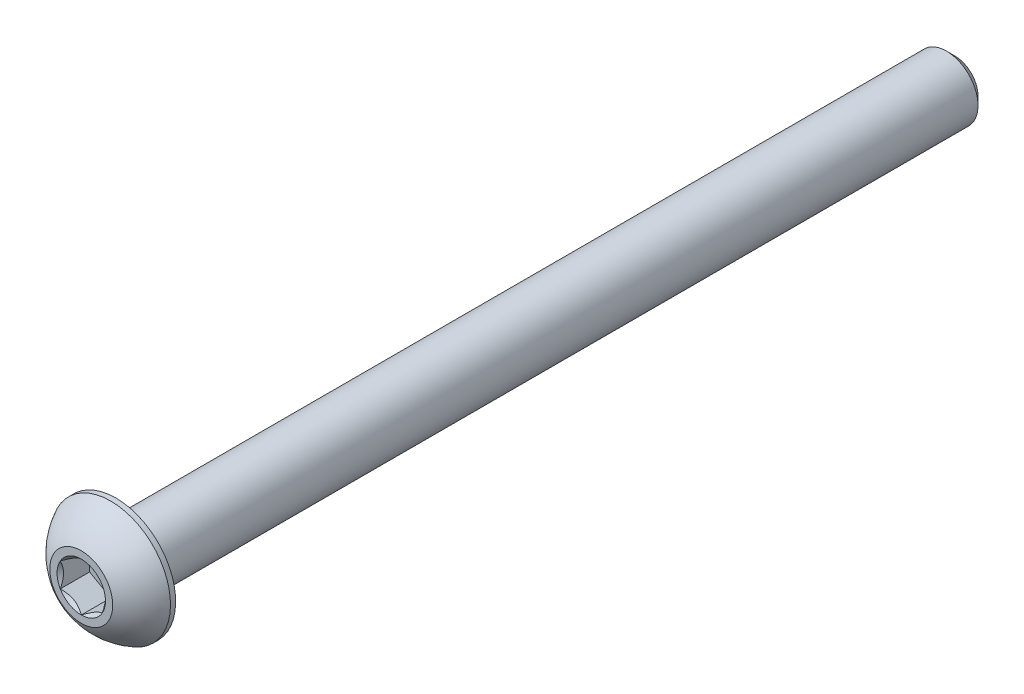
ISO-10303-21;
HEADER;
FILE_DESCRIPTION(('STEP AP214'),'2;1');
FILE_NAME('part.step','',(''),(''),'','','');
FILE_SCHEMA(('AUTOMOTIVE_DESIGN { 1 0 10303 214 1 1 1 1 }'));
ENDSEC;
DATA;
#1=APPLICATION_CONTEXT('core data for automotive mechanical design processes');
#2=APPLICATION_PROTOCOL_DEFINITION('international standard','automotive_design',2000,#1);
#3=PRODUCT_CONTEXT('',#1,'mechanical');
#4=PRODUCT('Part','Part','',(#3));
#5=PRODUCT_RELATED_PRODUCT_CATEGORY('part','',(#4));
#6=PRODUCT_DEFINITION_FORMATION('','',#4);
#7=PRODUCT_DEFINITION_CONTEXT('part definition',#1,'design');
#8=PRODUCT_DEFINITION('design','',#6,#7);
#9=PRODUCT_DEFINITION_SHAPE('','',#8);
#10=(LENGTH_UNIT() NAMED_UNIT(*) SI_UNIT(.MILLI.,.METRE.));
#11=(NAMED_UNIT(*) PLANE_ANGLE_UNIT() SI_UNIT($,.RADIAN.));
#12=(NAMED_UNIT(*) SI_UNIT($,.STERADIAN.) SOLID_ANGLE_UNIT());
#13=UNCERTAINTY_MEASURE_WITH_UNIT(LENGTH_MEASURE(1.E-05),#10,'distance_accuracy_value','');
#14=(GEOMETRIC_REPRESENTATION_CONTEXT(3) GLOBAL_UNCERTAINTY_ASSIGNED_CONTEXT((#13)) GLOBAL_UNIT_ASSIGNED_CONTEXT((#10,
#11,#12)) REPRESENTATION_CONTEXT('',''));
#15=CARTESIAN_POINT('',(0.,0.,0.));
#16=DIRECTION('',(0.,0.,1.));
#17=DIRECTION('',(1.,0.,0.));
#18=AXIS2_PLACEMENT_3D('',#15,#16,#17);
#19=CARTESIAN_POINT('',(1.,0.577350269189626,19.425));
#20=DIRECTION('',(0.5,0.866025403784439,0.));
#21=DIRECTION('',(0.,0.,-1.));
#22=AXIS2_PLACEMENT_3D('',#19,#20,#21);
#23=PLANE('',#22);
#24=DIRECTION('',(0.,0.,1.));
#25=VECTOR('',#24,1.);
#26=CARTESIAN_POINT('',(1.,0.577350269189626,19.425));
#27=LINE('',#26,#25);
#28=CARTESIAN_POINT('',(1.,0.577350269189626,19.425));
#29=VERTEX_POINT('',#28);
#30=CARTESIAN_POINT('',(1.,0.577350269189626,20.825));
#31=VERTEX_POINT('',#30);
#32=EDGE_CURVE('E11',#29,#31,#27,.T.);
#33=ORIENTED_EDGE('',*,*,#32,.T.);
#34=CARTESIAN_POINT('',(0.999999999999941,0.57735026918966,20.825));
#35=CARTESIAN_POINT('',(0.499999999999998,0.86602540378444,20.5363248654052));
#36=CARTESIAN_POINT('',(0.,1.15470053837922,20.825));
#37=(BOUNDED_CURVE() B_SPLINE_CURVE(2,(#34,#35,#36),.UNSPECIFIED.,.F.,
.F.) B_SPLINE_CURVE_WITH_KNOTS((3,3),(-0.321867155116298,-0.124274873543864),
.UNSPECIFIED.) CURVE() GEOMETRIC_REPRESENTATION_ITEM() RATIONAL_B_SPLINE_CURVE((1.46410161513779,
1.6905989232415,1.46410161513779)) REPRESENTATION_ITEM(''));
#38=CARTESIAN_POINT('',(0.,1.15470053837925,20.825));
#39=VERTEX_POINT('',#38);
#40=EDGE_CURVE('E123',#31,#39,#37,.T.);
#41=ORIENTED_EDGE('',*,*,#40,.T.);
#42=DIRECTION('',(0.,0.,1.));
#43=VECTOR('',#42,1.);
#44=CARTESIAN_POINT('',(0.,1.15470053837925,19.425));
#45=LINE('',#44,#43);
#46=CARTESIAN_POINT('',(0.,1.15470053837925,19.425));
#47=VERTEX_POINT('',#46);
#48=EDGE_CURVE('E257',#47,#39,#45,.T.);
#49=ORIENTED_EDGE('',*,*,#48,.F.);
#50=DIRECTION('',(-0.866025403784439,0.5,0.));
#51=VECTOR('',#50,1.);
#52=CARTESIAN_POINT('',(1.,0.577350269189626,19.425));
#53=LINE('',#52,#51);
#54=EDGE_CURVE('E237',#29,#47,#53,.T.);
#55=ORIENTED_EDGE('',*,*,#54,.F.);
#56=EDGE_LOOP('',(#33,#41,#49,#55));
#57=FACE_BOUND('',#56,.T.);
#58=ADVANCED_FACE('F17',(#57),#23,.F.);
#59=CARTESIAN_POINT('',(1.,-0.577350269189626,19.425));
#60=DIRECTION('',(1.,0.,0.));
#61=DIRECTION('',(0.,1.,0.));
#62=AXIS2_PLACEMENT_3D('',#59,#60,#61);
#63=PLANE('',#62);
#64=DIRECTION('',(0.,0.,1.));
#65=VECTOR('',#64,1.);
#66=CARTESIAN_POINT('',(1.,-0.577350269189626,19.425));
#67=LINE('',#66,#65);
#68=CARTESIAN_POINT('',(1.,-0.577350269189626,19.425));
#69=VERTEX_POINT('',#68);
#70=CARTESIAN_POINT('',(1.,-0.577350269189626,20.825));
#71=VERTEX_POINT('',#70);
#72=EDGE_CURVE('E25',#69,#71,#67,.T.);
#73=ORIENTED_EDGE('',*,*,#72,.T.);
#74=CARTESIAN_POINT('',(1.,-0.577350269189553,20.825));
#75=CARTESIAN_POINT('',(1.,0.,20.5363248654052));
#76=CARTESIAN_POINT('',(1.,0.577350269189567,20.825));
#77=(BOUNDED_CURVE() B_SPLINE_CURVE(2,(#74,#75,#76),.UNSPECIFIED.,.F.,
.F.) B_SPLINE_CURVE_WITH_KNOTS((3,3),(-0.321867155116297,-0.124274873543864),
.UNSPECIFIED.) CURVE() GEOMETRIC_REPRESENTATION_ITEM() RATIONAL_B_SPLINE_CURVE((1.46410161513779,
1.6905989232415,1.46410161513779)) REPRESENTATION_ITEM(''));
#78=EDGE_CURVE('E112',#71,#31,#77,.T.);
#79=ORIENTED_EDGE('',*,*,#78,.T.);
#80=ORIENTED_EDGE('',*,*,#32,.F.);
#81=DIRECTION('',(0.,1.,0.));
#82=VECTOR('',#81,1.);
#83=CARTESIAN_POINT('',(1.,-0.577350269189626,19.425));
#84=LINE('',#83,#82);
#85=EDGE_CURVE('E114',#69,#29,#84,.T.);
#86=ORIENTED_EDGE('',*,*,#85,.F.);
#87=EDGE_LOOP('',(#73,#79,#80,#86));
#88=FACE_BOUND('',#87,.T.);
#89=ADVANCED_FACE('F110',(#88),#63,.F.);
#90=CARTESIAN_POINT('',(0.,-1.15470053837925,19.425));
#91=DIRECTION('',(0.5,-0.866025403784439,0.));
#92=DIRECTION('',(0.,0.,-1.));
#93=AXIS2_PLACEMENT_3D('',#90,#91,#92);
#94=PLANE('',#93);
#95=DIRECTION('',(0.,0.,1.));
#96=VECTOR('',#95,1.);
#97=CARTESIAN_POINT('',(0.,-1.15470053837925,19.425));
#98=LINE('',#97,#96);
#99=CARTESIAN_POINT('',(0.,-1.15470053837925,19.425));
#100=VERTEX_POINT('',#99);
#101=CARTESIAN_POINT('',(0.,-1.15470053837925,20.825));
#102=VERTEX_POINT('',#101);
#103=EDGE_CURVE('E46',#100,#102,#98,.T.);
#104=ORIENTED_EDGE('',*,*,#103,.T.);
#105=CARTESIAN_POINT('',(0.,-1.15470053837922,20.825));
#106=CARTESIAN_POINT('',(0.500000000000004,-0.866025403784436,20.5363248654052));
#107=CARTESIAN_POINT('',(0.999999999999948,-0.577350269189655,20.825));
#108=(BOUNDED_CURVE() B_SPLINE_CURVE(2,(#105,#106,#107),.UNSPECIFIED.,.F.,
.F.) B_SPLINE_CURVE_WITH_KNOTS((3,3),(-0.321867155116297,-0.124274873543864),
.UNSPECIFIED.) CURVE() GEOMETRIC_REPRESENTATION_ITEM() RATIONAL_B_SPLINE_CURVE((1.46410161513779,
1.6905989232415,1.46410161513779)) REPRESENTATION_ITEM(''));
#109=EDGE_CURVE('E118',#102,#71,#108,.T.);
#110=ORIENTED_EDGE('',*,*,#109,.T.);
#111=ORIENTED_EDGE('',*,*,#72,.F.);
#112=DIRECTION('',(0.866025403784439,0.5,0.));
#113=VECTOR('',#112,1.);
#114=CARTESIAN_POINT('',(0.,-1.15470053837925,19.425));
#115=LINE('',#114,#113);
#116=EDGE_CURVE('E256',#100,#69,#115,.T.);
#117=ORIENTED_EDGE('',*,*,#116,.F.);
#118=EDGE_LOOP('',(#104,#110,#111,#117));
#119=FACE_BOUND('',#118,.T.);
#120=ADVANCED_FACE('F120',(#119),#94,.F.);
#121=CARTESIAN_POINT('',(-1.,-0.577350269189625,19.425));
#122=DIRECTION('',(-0.5,-0.866025403784439,0.));
#123=DIRECTION('',(-0.866025403784439,0.5,0.));
#124=AXIS2_PLACEMENT_3D('',#121,#122,#123);
#125=PLANE('',#124);
#126=DIRECTION('',(0.,0.,1.));
#127=VECTOR('',#126,1.);
#128=CARTESIAN_POINT('',(-1.,-0.577350269189625,19.425));
#129=LINE('',#128,#127);
#130=CARTESIAN_POINT('',(-1.,-0.577350269189625,19.425));
#131=VERTEX_POINT('',#130);
#132=CARTESIAN_POINT('',(-1.,-0.577350269189626,20.825));
#133=VERTEX_POINT('',#132);
#134=EDGE_CURVE('E267',#131,#133,#129,.T.);
#135=ORIENTED_EDGE('',*,*,#134,.T.);
#136=CARTESIAN_POINT('',(-0.999999999999945,-0.577350269189657,20.825));
#137=CARTESIAN_POINT('',(-0.499999999999999,-0.866025403784439,20.5363248654052));
#138=CARTESIAN_POINT('',(0.,-1.15470053837922,20.825));
#139=(BOUNDED_CURVE() B_SPLINE_CURVE(2,(#136,#137,#138),.UNSPECIFIED.,.F.,
.F.) B_SPLINE_CURVE_WITH_KNOTS((3,3),(-0.321867155116298,-0.124274873543864),
.UNSPECIFIED.) CURVE() GEOMETRIC_REPRESENTATION_ITEM() RATIONAL_B_SPLINE_CURVE((1.46410161513779,
1.6905989232415,1.46410161513779)) REPRESENTATION_ITEM(''));
#140=EDGE_CURVE('E124',#133,#102,#139,.T.);
#141=ORIENTED_EDGE('',*,*,#140,.T.);
#142=ORIENTED_EDGE('',*,*,#103,.F.);
#143=DIRECTION('',(0.866025403784439,-0.5,0.));
#144=VECTOR('',#143,1.);
#145=CARTESIAN_POINT('',(-1.,-0.577350269189625,19.425));
#146=LINE('',#145,#144);
#147=EDGE_CURVE('E252',#131,#100,#146,.T.);
#148=ORIENTED_EDGE('',*,*,#147,.F.);
#149=EDGE_LOOP('',(#135,#141,#142,#148));
#150=FACE_BOUND('',#149,.T.);
#151=ADVANCED_FACE('F387',(#150),#125,.F.);
#152=CARTESIAN_POINT('',(-1.,0.577350269189626,19.425));
#153=DIRECTION('',(-1.,0.,0.));
#154=DIRECTION('',(0.,0.,1.));
#155=AXIS2_PLACEMENT_3D('',#152,#153,#154);
#156=PLANE('',#155);
#157=DIRECTION('',(0.,0.,1.));
#158=VECTOR('',#157,1.);
#159=CARTESIAN_POINT('',(-1.,0.577350269189626,19.425));
#160=LINE('',#159,#158);
#161=CARTESIAN_POINT('',(-1.,0.577350269189626,19.425));
#162=VERTEX_POINT('',#161);
#163=CARTESIAN_POINT('',(-1.,0.577350269189627,20.825));
#164=VERTEX_POINT('',#163);
#165=EDGE_CURVE('E260',#162,#164,#160,.T.);
#166=ORIENTED_EDGE('',*,*,#165,.T.);
#167=CARTESIAN_POINT('',(-1.,0.57735026918957,20.825));
#168=CARTESIAN_POINT('',(-1.,0.,20.5363248654052));
#169=CARTESIAN_POINT('',(-1.,-0.577350269189566,20.825));
#170=(BOUNDED_CURVE() B_SPLINE_CURVE(2,(#167,#168,#169),.UNSPECIFIED.,.F.,
.F.) B_SPLINE_CURVE_WITH_KNOTS((3,3),(-0.3218671551163,-0.124274873543864),
.UNSPECIFIED.) CURVE() GEOMETRIC_REPRESENTATION_ITEM() RATIONAL_B_SPLINE_CURVE((1.46410161513778,
1.6905989232415,1.46410161513779)) REPRESENTATION_ITEM(''));
#171=EDGE_CURVE('E208',#164,#133,#170,.T.);
#172=ORIENTED_EDGE('',*,*,#171,.T.);
#173=ORIENTED_EDGE('',*,*,#134,.F.);
#174=DIRECTION('',(0.,-1.,0.));
#175=VECTOR('',#174,1.);
#176=CARTESIAN_POINT('',(-1.,0.577350269189626,19.425));
#177=LINE('',#176,#175);
#178=EDGE_CURVE('E248',#162,#131,#177,.T.);
#179=ORIENTED_EDGE('',*,*,#178,.F.);
#180=EDGE_LOOP('',(#166,#172,#173,#179));
#181=FACE_BOUND('',#180,.T.);
#182=ADVANCED_FACE('F393',(#181),#156,.F.);
#183=CARTESIAN_POINT('',(0.,1.15470053837925,19.425));
#184=DIRECTION('',(-0.5,0.866025403784439,0.));
#185=DIRECTION('',(0.,0.,1.));
#186=AXIS2_PLACEMENT_3D('',#183,#184,#185);
#187=PLANE('',#186);
#188=ORIENTED_EDGE('',*,*,#48,.T.);
#189=CARTESIAN_POINT('',(0.,1.15470053837922,20.825));
#190=CARTESIAN_POINT('',(-0.500000000000004,0.866025403784437,20.5363248654052));
#191=CARTESIAN_POINT('',(-0.999999999999948,0.577350269189656,20.825));
#192=(BOUNDED_CURVE() B_SPLINE_CURVE(2,(#189,#190,#191),.UNSPECIFIED.,.F.,
.F.) B_SPLINE_CURVE_WITH_KNOTS((3,3),(-0.321867155116297,-0.124274873543864),
.UNSPECIFIED.) CURVE() GEOMETRIC_REPRESENTATION_ITEM() RATIONAL_B_SPLINE_CURVE((1.46410161513779,
1.6905989232415,1.46410161513779)) REPRESENTATION_ITEM(''));
#193=EDGE_CURVE('E183',#39,#164,#192,.T.);
#194=ORIENTED_EDGE('',*,*,#193,.T.);
#195=ORIENTED_EDGE('',*,*,#165,.F.);
#196=DIRECTION('',(-0.866025403784439,-0.5,0.));
#197=VECTOR('',#196,1.);
#198=CARTESIAN_POINT('',(0.,1.15470053837925,19.425));
#199=LINE('',#198,#197);
#200=EDGE_CURVE('E244',#47,#162,#199,.T.);
#201=ORIENTED_EDGE('',*,*,#200,.F.);
#202=EDGE_LOOP('',(#188,#194,#195,#201));
#203=FACE_BOUND('',#202,.T.);
#204=ADVANCED_FACE('F380',(#203),#187,.F.);
#205=CARTESIAN_POINT('',(0.,0.,19.425));
#206=DIRECTION('',(0.,0.,1.));
#207=DIRECTION('',(1.,0.,0.));
#208=AXIS2_PLACEMENT_3D('',#205,#206,#207);
#209=PLANE('',#208);
#210=ORIENTED_EDGE('',*,*,#54,.T.);
#211=ORIENTED_EDGE('',*,*,#200,.T.);
#212=ORIENTED_EDGE('',*,*,#178,.T.);
#213=ORIENTED_EDGE('',*,*,#147,.T.);
#214=ORIENTED_EDGE('',*,*,#116,.T.);
#215=ORIENTED_EDGE('',*,*,#85,.T.);
#216=EDGE_LOOP('',(#210,#211,#212,#213,#214,#215));
#217=FACE_BOUND('',#216,.T.);
#218=ADVANCED_FACE('F386',(#217),#209,.T.);
#219=CARTESIAN_POINT('',(0.,0.,20.825));
#220=DIRECTION('',(0.,0.,1.));
#221=DIRECTION('',(1.,0.,0.));
#222=AXIS2_PLACEMENT_3D('',#219,#220,#221);
#223=CONICAL_SURFACE('',#222,1.15470053837925,0.78539816339745);
#224=CARTESIAN_POINT('',(0.,0.,20.825));
#225=DIRECTION('',(0.,0.,1.));
#226=DIRECTION('',(1.,0.,0.));
#227=AXIS2_PLACEMENT_3D('',#224,#225,#226);
#228=CIRCLE('',#227,1.15470053837925);
#229=EDGE_CURVE('E134',#31,#39,#228,.T.);
#230=ORIENTED_EDGE('',*,*,#229,.T.);
#231=ORIENTED_EDGE('',*,*,#40,.F.);
#232=EDGE_LOOP('',(#230,#231));
#233=FACE_BOUND('',#232,.T.);
#234=ADVANCED_FACE('F374',(#233),#223,.F.);
#235=CARTESIAN_POINT('',(0.,0.,20.825));
#236=DIRECTION('',(0.,0.,1.));
#237=DIRECTION('',(1.,0.,0.));
#238=AXIS2_PLACEMENT_3D('',#235,#236,#237);
#239=CONICAL_SURFACE('',#238,1.15470053837925,0.78539816339745);
#240=CARTESIAN_POINT('',(0.,0.,20.825));
#241=DIRECTION('',(0.,0.,1.));
#242=DIRECTION('',(1.,0.,0.));
#243=AXIS2_PLACEMENT_3D('',#240,#241,#242);
#244=CIRCLE('',#243,1.15470053837925);
#245=EDGE_CURVE('E127',#102,#71,#244,.T.);
#246=ORIENTED_EDGE('',*,*,#245,.T.);
#247=ORIENTED_EDGE('',*,*,#109,.F.);
#248=EDGE_LOOP('',(#246,#247));
#249=FACE_BOUND('',#248,.T.);
#250=ADVANCED_FACE('F129',(#249),#239,.F.);
#251=CARTESIAN_POINT('',(0.,0.,20.825));
#252=DIRECTION('',(0.,0.,1.));
#253=DIRECTION('',(1.,0.,0.));
#254=AXIS2_PLACEMENT_3D('',#251,#252,#253);
#255=CONICAL_SURFACE('',#254,1.15470053837925,0.78539816339745);
#256=CARTESIAN_POINT('',(0.,0.,20.825));
#257=DIRECTION('',(0.,0.,1.));
#258=DIRECTION('',(1.,0.,0.));
#259=AXIS2_PLACEMENT_3D('',#256,#257,#258);
#260=CIRCLE('',#259,1.15470053837925);
#261=EDGE_CURVE('E133',#133,#102,#260,.T.);
#262=ORIENTED_EDGE('',*,*,#261,.T.);
#263=ORIENTED_EDGE('',*,*,#140,.F.);
#264=EDGE_LOOP('',(#262,#263));
#265=FACE_BOUND('',#264,.T.);
#266=ADVANCED_FACE('F391',(#265),#255,.F.);
#267=CARTESIAN_POINT('',(0.,0.,20.825));
#268=DIRECTION('',(0.,0.,1.));
#269=DIRECTION('',(-1.,0.,0.));
#270=AXIS2_PLACEMENT_3D('',#267,#268,#269);
#271=CONICAL_SURFACE('',#270,1.15470053837925,0.78539816339745);
#272=CARTESIAN_POINT('',(0.,0.,20.825));
#273=DIRECTION('',(0.,0.,1.));
#274=DIRECTION('',(1.,0.,0.));
#275=AXIS2_PLACEMENT_3D('',#272,#273,#274);
#276=CIRCLE('',#275,1.15470053837925);
#277=EDGE_CURVE('E180',#164,#133,#276,.T.);
#278=ORIENTED_EDGE('',*,*,#277,.T.);
#279=ORIENTED_EDGE('',*,*,#171,.F.);
#280=EDGE_LOOP('',(#278,#279));
#281=FACE_BOUND('',#280,.T.);
#282=ADVANCED_FACE('F395',(#281),#271,.F.);
#283=CARTESIAN_POINT('',(0.,0.,20.825));
#284=DIRECTION('',(0.,0.,1.));
#285=DIRECTION('',(1.,0.,0.));
#286=AXIS2_PLACEMENT_3D('',#283,#284,#285);
#287=CONICAL_SURFACE('',#286,1.15470053837925,0.78539816339745);
#288=CARTESIAN_POINT('',(0.,0.,20.825));
#289=DIRECTION('',(0.,0.,1.));
#290=DIRECTION('',(1.,0.,0.));
#291=AXIS2_PLACEMENT_3D('',#288,#289,#290);
#292=CIRCLE('',#291,1.15470053837925);
#293=EDGE_CURVE('E163',#39,#164,#292,.T.);
#294=ORIENTED_EDGE('',*,*,#293,.T.);
#295=ORIENTED_EDGE('',*,*,#193,.F.);
#296=EDGE_LOOP('',(#294,#295));
#297=FACE_BOUND('',#296,.T.);
#298=ADVANCED_FACE('F378',(#297),#287,.F.);
#299=CARTESIAN_POINT('',(0.,0.,-20.825));
#300=DIRECTION('',(0.,0.,1.));
#301=DIRECTION('',(0.,-1.,0.));
#302=AXIS2_PLACEMENT_3D('',#299,#300,#301);
#303=PLANE('',#302);
#304=CARTESIAN_POINT('',(0.,0.,-20.825));
#305=DIRECTION('',(0.,0.,1.));
#306=DIRECTION('',(0.,-1.,0.));
#307=AXIS2_PLACEMENT_3D('',#304,#305,#306);
#308=CIRCLE('',#307,1.1);
#309=CARTESIAN_POINT('',(0.,1.1,-20.825));
#310=VERTEX_POINT('',#309);
#311=EDGE_CURVE('E165',#310,#310,#308,.T.);
#312=ORIENTED_EDGE('',*,*,#311,.F.);
#313=EDGE_LOOP('',(#312));
#314=FACE_BOUND('',#313,.T.);
#315=ADVANCED_FACE('F404',(#314),#303,.F.);
#316=CARTESIAN_POINT('',(0.,1.5,19.175));
#317=DIRECTION('',(0.,0.,1.));
#318=DIRECTION('',(0.,-1.,0.));
#319=AXIS2_PLACEMENT_3D('',#316,#317,#318);
#320=PLANE('',#319);
#321=CARTESIAN_POINT('',(0.,0.,19.175));
#322=DIRECTION('',(0.,0.,1.));
#323=DIRECTION('',(0.,-1.,0.));
#324=AXIS2_PLACEMENT_3D('',#321,#322,#323);
#325=CIRCLE('',#324,1.5);
#326=CARTESIAN_POINT('',(0.,1.5,19.175));
#327=VERTEX_POINT('',#326);
#328=EDGE_CURVE('E167',#327,#327,#325,.T.);
#329=ORIENTED_EDGE('',*,*,#328,.T.);
#330=EDGE_LOOP('',(#329));
#331=FACE_BOUND('',#330,.T.);
#332=CARTESIAN_POINT('',(0.,0.,19.175));
#333=DIRECTION('',(0.,0.,1.));
#334=DIRECTION('',(0.,-1.,0.));
#335=AXIS2_PLACEMENT_3D('',#332,#333,#334);
#336=CIRCLE('',#335,2.85);
#337=CARTESIAN_POINT('',(0.,2.85,19.175));
#338=VERTEX_POINT('',#337);
#339=EDGE_CURVE('E164',#338,#338,#336,.T.);
#340=ORIENTED_EDGE('',*,*,#339,.F.);
#341=EDGE_LOOP('',(#340));
#342=FACE_BOUND('',#341,.T.);
#343=ADVANCED_FACE('F436',(#331,#342),#320,.F.);
#344=CARTESIAN_POINT('',(0.,0.,20.825));
#345=DIRECTION('',(0.,0.,-1.));
#346=DIRECTION('',(0.,-1.,0.));
#347=AXIS2_PLACEMENT_3D('',#344,#345,#346);
#348=PLANE('',#347);
#349=ORIENTED_EDGE('',*,*,#293,.F.);
#350=ORIENTED_EDGE('',*,*,#229,.F.);
#351=CARTESIAN_POINT('',(0.,0.,20.825));
#352=DIRECTION('',(0.,0.,1.));
#353=DIRECTION('',(1.,0.,0.));
#354=AXIS2_PLACEMENT_3D('',#351,#352,#353);
#355=CIRCLE('',#354,1.15470053837925);
#356=EDGE_CURVE('E138',#71,#31,#355,.T.);
#357=ORIENTED_EDGE('',*,*,#356,.F.);
#358=ORIENTED_EDGE('',*,*,#245,.F.);
#359=ORIENTED_EDGE('',*,*,#261,.F.);
#360=ORIENTED_EDGE('',*,*,#277,.F.);
#361=EDGE_LOOP('',(#349,#350,#357,#358,#359,#360));
#362=FACE_BOUND('',#361,.T.);
#363=CARTESIAN_POINT('',(0.,0.,20.825));
#364=DIRECTION('',(0.,0.,1.));
#365=DIRECTION('',(0.,-1.,0.));
#366=AXIS2_PLACEMENT_3D('',#363,#364,#365);
#367=CIRCLE('',#366,1.5);
#368=CARTESIAN_POINT('',(0.,1.5,20.825));
#369=VERTEX_POINT('',#368);
#370=EDGE_CURVE('E157',#369,#369,#367,.T.);
#371=ORIENTED_EDGE('',*,*,#370,.T.);
#372=EDGE_LOOP('',(#371));
#373=FACE_BOUND('',#372,.T.);
#374=ADVANCED_FACE('F140',(#362,#373),#348,.F.);
#375=CARTESIAN_POINT('',(0.,0.,18.0301671122995));
#376=DIRECTION('',(-1.,0.,0.));
#377=DIRECTION('',(0.,1.,0.));
#378=AXIS2_PLACEMENT_3D('',#375,#376,#377);
#379=SPHERICAL_SURFACE('',#378,3.17192226735973);
#380=CARTESIAN_POINT('',(0.,0.,18.0301671122995));
#381=DIRECTION('',(0.,0.,1.));
#382=DIRECTION('',(0.,-1.,0.));
#383=AXIS2_PLACEMENT_3D('',#380,#381,#382);
#384=SPHERICAL_SURFACE('',#383,3.17192226735973);
#385=ORIENTED_EDGE('',*,*,#370,.F.);
#386=EDGE_LOOP('',(#385));
#387=FACE_BOUND('',#386,.T.);
#388=CARTESIAN_POINT('',(0.,0.,19.4225));
#389=DIRECTION('',(0.,0.,1.));
#390=DIRECTION('',(0.,-1.,0.));
#391=AXIS2_PLACEMENT_3D('',#388,#389,#390);
#392=CIRCLE('',#391,2.85);
#393=CARTESIAN_POINT('',(0.,2.85,19.4225));
#394=VERTEX_POINT('',#393);
#395=EDGE_CURVE('E192',#394,#394,#392,.T.);
#396=ORIENTED_EDGE('',*,*,#395,.T.);
#397=EDGE_LOOP('',(#396));
#398=FACE_BOUND('',#397,.T.);
#399=ADVANCED_FACE('F460',(#387,#398),#384,.T.);
#400=CARTESIAN_POINT('',(0.,0.,20.825));
#401=DIRECTION('',(0.,0.,1.));
#402=DIRECTION('',(0.,-1.,0.));
#403=AXIS2_PLACEMENT_3D('',#400,#401,#402);
#404=CYLINDRICAL_SURFACE('',#403,2.85);
#405=ORIENTED_EDGE('',*,*,#395,.F.);
#406=DIRECTION('',(0.,0.,-1.));
#407=VECTOR('',#406,1.);
#408=CARTESIAN_POINT('',(0.,2.85,20.825));
#409=LINE('',#408,#407);
#410=EDGE_CURVE('E188',#394,#338,#409,.T.);
#411=ORIENTED_EDGE('',*,*,#410,.T.);
#412=ORIENTED_EDGE('',*,*,#339,.T.);
#413=ORIENTED_EDGE('',*,*,#410,.F.);
#414=EDGE_LOOP('',(#405,#411,#412,#413));
#415=FACE_BOUND('',#414,.T.);
#416=ADVANCED_FACE('F458',(#415),#404,.T.);
#417=CARTESIAN_POINT('',(0.,0.,20.825));
#418=DIRECTION('',(0.,0.,1.));
#419=DIRECTION('',(0.,-1.,0.));
#420=AXIS2_PLACEMENT_3D('',#417,#418,#419);
#421=CYLINDRICAL_SURFACE('',#420,1.5);
#422=ORIENTED_EDGE('',*,*,#328,.F.);
#423=DIRECTION('',(0.,0.,-1.));
#424=VECTOR('',#423,1.);
#425=CARTESIAN_POINT('',(0.,1.5,20.825));
#426=LINE('',#425,#424);
#427=CARTESIAN_POINT('',(0.,1.5,-20.425));
#428=VERTEX_POINT('',#427);
#429=EDGE_CURVE('E179',#327,#428,#426,.T.);
#430=ORIENTED_EDGE('',*,*,#429,.T.);
#431=CARTESIAN_POINT('',(0.,0.,-20.425));
#432=DIRECTION('',(0.,0.,1.));
#433=DIRECTION('',(0.,-1.,0.));
#434=AXIS2_PLACEMENT_3D('',#431,#432,#433);
#435=CIRCLE('',#434,1.5);
#436=EDGE_CURVE('E145',#428,#428,#435,.T.);
#437=ORIENTED_EDGE('',*,*,#436,.T.);
#438=ORIENTED_EDGE('',*,*,#429,.F.);
#439=EDGE_LOOP('',(#422,#430,#437,#438));
#440=FACE_BOUND('',#439,.T.);
#441=ADVANCED_FACE('F453',(#440),#421,.T.);
#442=CARTESIAN_POINT('',(0.,0.,-20.825));
#443=DIRECTION('',(0.,0.,1.));
#444=DIRECTION('',(0.,-1.,0.));
#445=AXIS2_PLACEMENT_3D('',#442,#443,#444);
#446=CONICAL_SURFACE('',#445,1.1,0.785398163397448);
#447=ORIENTED_EDGE('',*,*,#436,.F.);
#448=DIRECTION('',(0.,-0.707106781186548,-0.707106781186548));
#449=VECTOR('',#448,1.);
#450=CARTESIAN_POINT('',(0.,1.1,-20.825));
#451=LINE('',#450,#449);
#452=EDGE_CURVE('E168',#428,#310,#451,.T.);
#453=ORIENTED_EDGE('',*,*,#452,.T.);
#454=ORIENTED_EDGE('',*,*,#311,.T.);
#455=ORIENTED_EDGE('',*,*,#452,.F.);
#456=EDGE_LOOP('',(#447,#453,#454,#455));
#457=FACE_BOUND('',#456,.T.);
#458=ADVANCED_FACE('F450',(#457),#446,.T.);
#459=CARTESIAN_POINT('',(0.,0.,20.825));
#460=DIRECTION('',(0.,0.,1.));
#461=DIRECTION('',(1.,0.,0.));
#462=AXIS2_PLACEMENT_3D('',#459,#460,#461);
#463=CONICAL_SURFACE('',#462,1.15470053837925,0.78539816339745);
#464=ORIENTED_EDGE('',*,*,#78,.F.);
#465=ORIENTED_EDGE('',*,*,#356,.T.);
#466=EDGE_LOOP('',(#464,#465));
#467=FACE_BOUND('',#466,.T.);
#468=ADVANCED_FACE('F147',(#467),#463,.F.);
#469=CLOSED_SHELL('',(#58,#89,#120,#151,#182,#204,#218,#234,#250,#266,#282,#298,#315,#343,#374,
#399,#416,#441,#458,#468));
#470=MANIFOLD_SOLID_BREP('B1',#469);
#471=ADVANCED_BREP_SHAPE_REPRESENTATION('',(#18,#470),#14);
#472=SHAPE_DEFINITION_REPRESENTATION(#9,#471);
ENDSEC;
END-ISO-10303-21;
